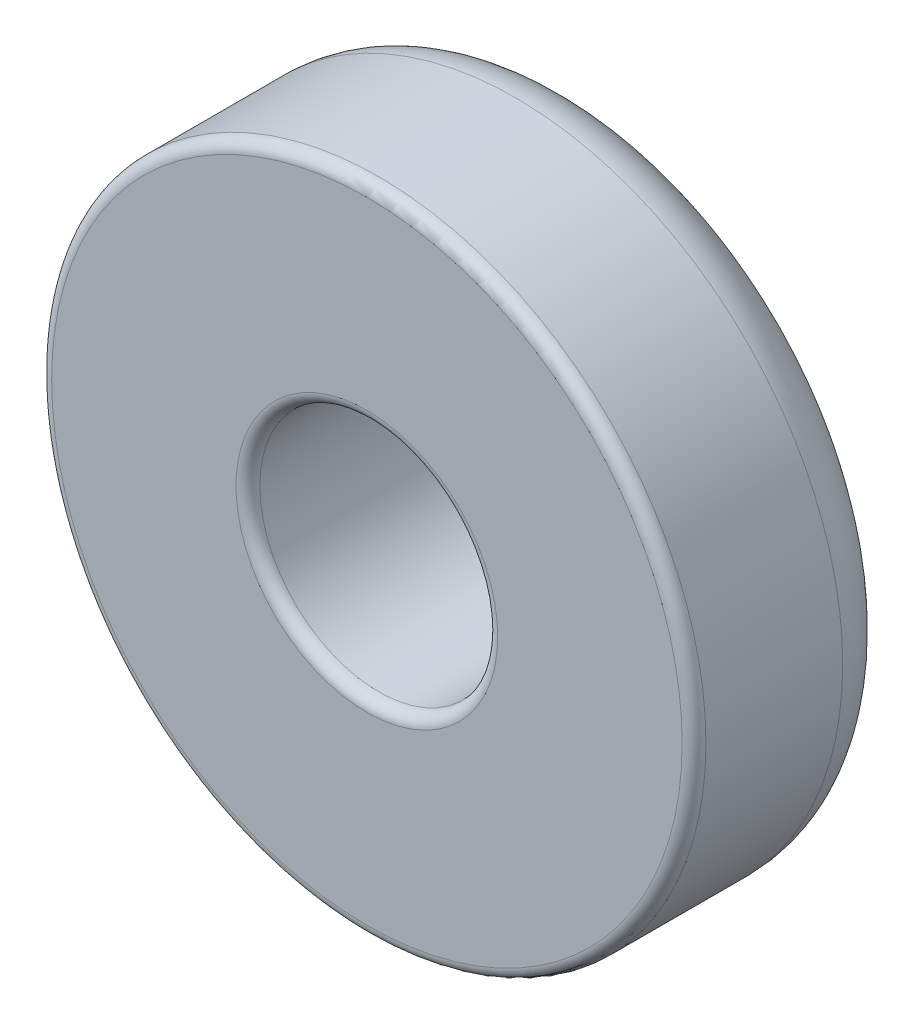
ISO-10303-21;
HEADER;
FILE_DESCRIPTION(('STEP AP214'),'2;1');
FILE_NAME('part.step','',(''),(''),'','','');
FILE_SCHEMA(('AUTOMOTIVE_DESIGN { 1 0 10303 214 1 1 1 1 }'));
ENDSEC;
DATA;
#1=APPLICATION_CONTEXT('core data for automotive mechanical design processes');
#2=APPLICATION_PROTOCOL_DEFINITION('international standard','automotive_design',2000,#1);
#3=PRODUCT_CONTEXT('',#1,'mechanical');
#4=PRODUCT('Part','Part','',(#3));
#5=PRODUCT_RELATED_PRODUCT_CATEGORY('part','',(#4));
#6=PRODUCT_DEFINITION_FORMATION('','',#4);
#7=PRODUCT_DEFINITION_CONTEXT('part definition',#1,'design');
#8=PRODUCT_DEFINITION('design','',#6,#7);
#9=PRODUCT_DEFINITION_SHAPE('','',#8);
#10=(LENGTH_UNIT() NAMED_UNIT(*) SI_UNIT(.MILLI.,.METRE.));
#11=(NAMED_UNIT(*) PLANE_ANGLE_UNIT() SI_UNIT($,.RADIAN.));
#12=(NAMED_UNIT(*) SI_UNIT($,.STERADIAN.) SOLID_ANGLE_UNIT());
#13=UNCERTAINTY_MEASURE_WITH_UNIT(LENGTH_MEASURE(1.E-05),#10,'distance_accuracy_value','');
#14=(GEOMETRIC_REPRESENTATION_CONTEXT(3) GLOBAL_UNCERTAINTY_ASSIGNED_CONTEXT((#13)) GLOBAL_UNIT_ASSIGNED_CONTEXT((#10,
#11,#12)) REPRESENTATION_CONTEXT('',''));
#15=CARTESIAN_POINT('',(0.,0.,0.));
#16=DIRECTION('',(0.,0.,1.));
#17=DIRECTION('',(1.,0.,0.));
#18=AXIS2_PLACEMENT_3D('',#15,#16,#17);
#19=CARTESIAN_POINT('',(0.,0.,1.75));
#20=DIRECTION('',(0.,0.,1.));
#21=DIRECTION('',(1.,0.,0.));
#22=AXIS2_PLACEMENT_3D('',#19,#20,#21);
#23=PLANE('',#22);
#24=CARTESIAN_POINT('',(0.,0.,1.75));
#25=DIRECTION('',(0.,0.,1.));
#26=DIRECTION('',(1.,0.,0.));
#27=AXIS2_PLACEMENT_3D('',#24,#25,#26);
#28=CIRCLE('',#27,1.1);
#29=CARTESIAN_POINT('',(1.1,0.,1.75));
#30=VERTEX_POINT('',#29);
#31=EDGE_CURVE('E56',#30,#30,#28,.F.);
#32=ORIENTED_EDGE('',*,*,#31,.T.);
#33=EDGE_LOOP('',(#32));
#34=FACE_BOUND('',#33,.T.);
#35=CARTESIAN_POINT('',(0.,0.,1.75));
#36=DIRECTION('',(0.,0.,1.));
#37=DIRECTION('',(1.,0.,0.));
#38=AXIS2_PLACEMENT_3D('',#35,#36,#37);
#39=CIRCLE('',#38,2.65);
#40=CARTESIAN_POINT('',(2.65,0.,1.75));
#41=VERTEX_POINT('',#40);
#42=EDGE_CURVE('E61',#41,#41,#39,.T.);
#43=ORIENTED_EDGE('',*,*,#42,.T.);
#44=EDGE_LOOP('',(#43));
#45=FACE_BOUND('',#44,.T.);
#46=ADVANCED_FACE('F43',(#34,#45),#23,.T.);
#47=CARTESIAN_POINT('',(0.,0.,0.));
#48=DIRECTION('',(0.,0.,1.));
#49=DIRECTION('',(1.,0.,0.));
#50=AXIS2_PLACEMENT_3D('',#47,#48,#49);
#51=PLANE('',#50);
#52=CARTESIAN_POINT('',(0.,0.,0.));
#53=DIRECTION('',(0.,0.,1.));
#54=DIRECTION('',(1.,0.,0.));
#55=AXIS2_PLACEMENT_3D('',#52,#53,#54);
#56=CIRCLE('',#55,1.1);
#57=CARTESIAN_POINT('',(1.1,0.,0.));
#58=VERTEX_POINT('',#57);
#59=EDGE_CURVE('E11',#58,#58,#56,.T.);
#60=ORIENTED_EDGE('',*,*,#59,.T.);
#61=EDGE_LOOP('',(#60));
#62=FACE_BOUND('',#61,.T.);
#63=CARTESIAN_POINT('',(0.,0.,0.));
#64=DIRECTION('',(0.,0.,1.));
#65=DIRECTION('',(1.,0.,0.));
#66=AXIS2_PLACEMENT_3D('',#63,#64,#65);
#67=CIRCLE('',#66,2.25);
#68=CARTESIAN_POINT('',(2.25,0.,0.));
#69=VERTEX_POINT('',#68);
#70=EDGE_CURVE('E75',#69,#69,#67,.F.);
#71=ORIENTED_EDGE('',*,*,#70,.T.);
#72=EDGE_LOOP('',(#71));
#73=FACE_BOUND('',#72,.T.);
#74=ADVANCED_FACE('F104',(#62,#73),#51,.F.);
#75=CARTESIAN_POINT('',(0.,0.,1.75));
#76=DIRECTION('',(0.,0.,-1.));
#77=DIRECTION('',(-1.,0.,0.));
#78=AXIS2_PLACEMENT_3D('',#75,#76,#77);
#79=CYLINDRICAL_SURFACE('',#78,2.75);
#80=CARTESIAN_POINT('',(0.,0.,1.65));
#81=DIRECTION('',(0.,0.,1.));
#82=DIRECTION('',(1.,0.,0.));
#83=AXIS2_PLACEMENT_3D('',#80,#81,#82);
#84=CIRCLE('',#83,2.75);
#85=CARTESIAN_POINT('',(2.75,0.,1.65));
#86=VERTEX_POINT('',#85);
#87=EDGE_CURVE('E51',#86,#86,#84,.F.);
#88=ORIENTED_EDGE('',*,*,#87,.T.);
#89=EDGE_LOOP('',(#88));
#90=FACE_BOUND('',#89,.T.);
#91=CARTESIAN_POINT('',(0.,0.,0.5));
#92=DIRECTION('',(0.,0.,1.));
#93=DIRECTION('',(1.,0.,0.));
#94=AXIS2_PLACEMENT_3D('',#91,#92,#93);
#95=CIRCLE('',#94,2.75);
#96=CARTESIAN_POINT('',(2.75,0.,0.5));
#97=VERTEX_POINT('',#96);
#98=EDGE_CURVE('E79',#97,#97,#95,.T.);
#99=ORIENTED_EDGE('',*,*,#98,.T.);
#100=EDGE_LOOP('',(#99));
#101=FACE_BOUND('',#100,.T.);
#102=ADVANCED_FACE('F84',(#90,#101),#79,.T.);
#103=CARTESIAN_POINT('',(0.,0.,1.75));
#104=DIRECTION('',(0.,0.,-1.));
#105=DIRECTION('',(-1.,0.,0.));
#106=AXIS2_PLACEMENT_3D('',#103,#104,#105);
#107=CYLINDRICAL_SURFACE('',#106,1.);
#108=CARTESIAN_POINT('',(0.,0.,1.65));
#109=DIRECTION('',(0.,0.,1.));
#110=DIRECTION('',(1.,0.,0.));
#111=AXIS2_PLACEMENT_3D('',#108,#109,#110);
#112=CIRCLE('',#111,1.);
#113=CARTESIAN_POINT('',(1.,0.,1.65));
#114=VERTEX_POINT('',#113);
#115=EDGE_CURVE('E67',#114,#114,#112,.T.);
#116=ORIENTED_EDGE('',*,*,#115,.T.);
#117=EDGE_LOOP('',(#116));
#118=FACE_BOUND('',#117,.T.);
#119=CARTESIAN_POINT('',(0.,0.,0.1));
#120=DIRECTION('',(0.,0.,1.));
#121=DIRECTION('',(1.,0.,0.));
#122=AXIS2_PLACEMENT_3D('',#119,#120,#121);
#123=CIRCLE('',#122,1.);
#124=CARTESIAN_POINT('',(1.,0.,0.1));
#125=VERTEX_POINT('',#124);
#126=EDGE_CURVE('E71',#125,#125,#123,.F.);
#127=ORIENTED_EDGE('',*,*,#126,.T.);
#128=EDGE_LOOP('',(#127));
#129=FACE_BOUND('',#128,.T.);
#130=ADVANCED_FACE('F89',(#118,#129),#107,.F.);
#131=CARTESIAN_POINT('',(0.,0.,0.5));
#132=DIRECTION('',(0.,0.,1.));
#133=DIRECTION('',(1.,0.,0.));
#134=AXIS2_PLACEMENT_3D('',#131,#132,#133);
#135=TOROIDAL_SURFACE('',#134,2.25,0.5);
#136=ORIENTED_EDGE('',*,*,#70,.F.);
#137=EDGE_LOOP('',(#136));
#138=FACE_BOUND('',#137,.T.);
#139=ORIENTED_EDGE('',*,*,#98,.F.);
#140=EDGE_LOOP('',(#139));
#141=FACE_BOUND('',#140,.T.);
#142=ADVANCED_FACE('F86',(#138,#141),#135,.T.);
#143=CARTESIAN_POINT('',(0.,0.,1.65));
#144=DIRECTION('',(0.,0.,1.));
#145=DIRECTION('',(1.,0.,0.));
#146=AXIS2_PLACEMENT_3D('',#143,#144,#145);
#147=TOROIDAL_SURFACE('',#146,1.1,0.1);
#148=ORIENTED_EDGE('',*,*,#31,.F.);
#149=EDGE_LOOP('',(#148));
#150=FACE_BOUND('',#149,.T.);
#151=ORIENTED_EDGE('',*,*,#115,.F.);
#152=EDGE_LOOP('',(#151));
#153=FACE_BOUND('',#152,.T.);
#154=ADVANCED_FACE('F88',(#150,#153),#147,.T.);
#155=CARTESIAN_POINT('',(0.,0.,1.65));
#156=DIRECTION('',(0.,0.,1.));
#157=DIRECTION('',(1.,0.,0.));
#158=AXIS2_PLACEMENT_3D('',#155,#156,#157);
#159=TOROIDAL_SURFACE('',#158,2.65,0.1);
#160=ORIENTED_EDGE('',*,*,#87,.F.);
#161=EDGE_LOOP('',(#160));
#162=FACE_BOUND('',#161,.T.);
#163=ORIENTED_EDGE('',*,*,#42,.F.);
#164=EDGE_LOOP('',(#163));
#165=FACE_BOUND('',#164,.T.);
#166=ADVANCED_FACE('F96',(#162,#165),#159,.T.);
#167=CARTESIAN_POINT('',(0.,0.,0.1));
#168=DIRECTION('',(0.,0.,1.));
#169=DIRECTION('',(1.,0.,0.));
#170=AXIS2_PLACEMENT_3D('',#167,#168,#169);
#171=TOROIDAL_SURFACE('',#170,1.1,0.1);
#172=ORIENTED_EDGE('',*,*,#126,.F.);
#173=EDGE_LOOP('',(#172));
#174=FACE_BOUND('',#173,.T.);
#175=ORIENTED_EDGE('',*,*,#59,.F.);
#176=EDGE_LOOP('',(#175));
#177=FACE_BOUND('',#176,.T.);
#178=ADVANCED_FACE('F45',(#174,#177),#171,.T.);
#179=CLOSED_SHELL('',(#46,#74,#102,#130,#142,#154,#166,#178));
#180=MANIFOLD_SOLID_BREP('B2',#179);
#181=ADVANCED_BREP_SHAPE_REPRESENTATION('',(#18,#180),#14);
#182=SHAPE_DEFINITION_REPRESENTATION(#9,#181);
ENDSEC;
END-ISO-10303-21;
